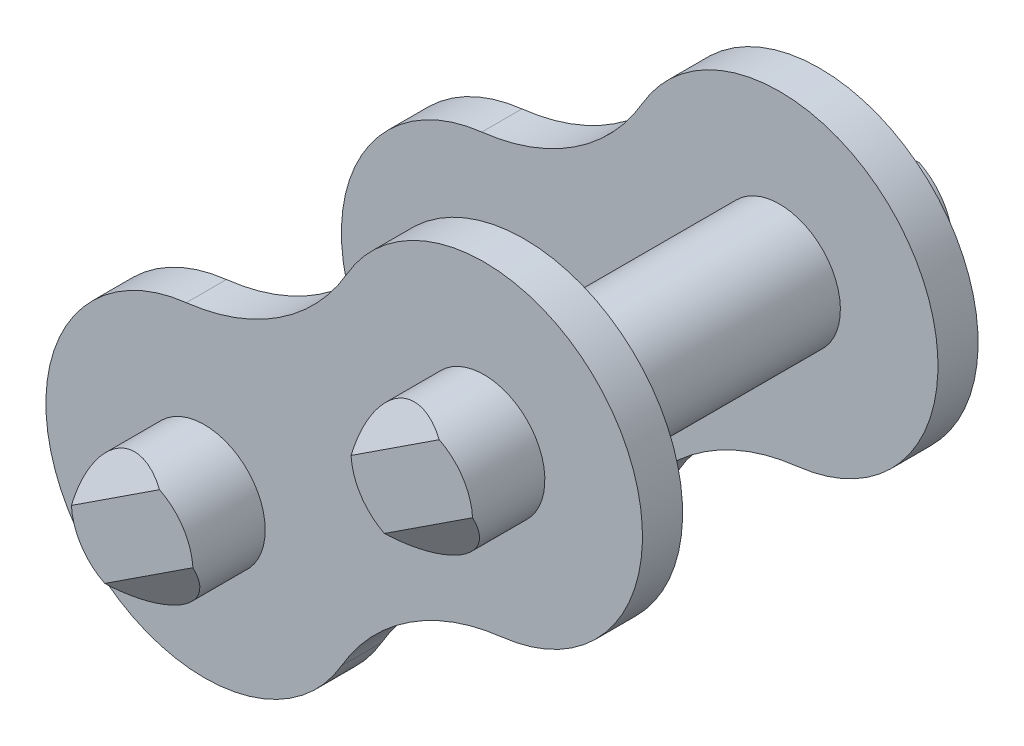
ISO-10303-21;
HEADER;
FILE_DESCRIPTION(('STEP AP214'),'2;1');
FILE_NAME('part.step','',(''),(''),'','','');
FILE_SCHEMA(('AUTOMOTIVE_DESIGN { 1 0 10303 214 1 1 1 1 }'));
ENDSEC;
DATA;
#1=APPLICATION_CONTEXT('core data for automotive mechanical design processes');
#2=APPLICATION_PROTOCOL_DEFINITION('international standard','automotive_design',2000,#1);
#3=PRODUCT_CONTEXT('',#1,'mechanical');
#4=PRODUCT('Part','Part','',(#3));
#5=PRODUCT_RELATED_PRODUCT_CATEGORY('part','',(#4));
#6=PRODUCT_DEFINITION_FORMATION('','',#4);
#7=PRODUCT_DEFINITION_CONTEXT('part definition',#1,'design');
#8=PRODUCT_DEFINITION('design','',#6,#7);
#9=PRODUCT_DEFINITION_SHAPE('','',#8);
#10=(LENGTH_UNIT() NAMED_UNIT(*) SI_UNIT(.MILLI.,.METRE.));
#11=(NAMED_UNIT(*) PLANE_ANGLE_UNIT() SI_UNIT($,.RADIAN.));
#12=(NAMED_UNIT(*) SI_UNIT($,.STERADIAN.) SOLID_ANGLE_UNIT());
#13=UNCERTAINTY_MEASURE_WITH_UNIT(LENGTH_MEASURE(1.E-05),#10,'distance_accuracy_value','');
#14=(GEOMETRIC_REPRESENTATION_CONTEXT(3) GLOBAL_UNCERTAINTY_ASSIGNED_CONTEXT((#13)) GLOBAL_UNIT_ASSIGNED_CONTEXT((#10,
#11,#12)) REPRESENTATION_CONTEXT('',''));
#15=CARTESIAN_POINT('',(0.,0.,0.));
#16=DIRECTION('',(0.,0.,1.));
#17=DIRECTION('',(1.,0.,0.));
#18=AXIS2_PLACEMENT_3D('',#15,#16,#17);
#19=CARTESIAN_POINT('',(136.884786211121,92.557643133282,-131.392489073474));
#20=DIRECTION('',(-0.273886737642538,0.418313345404528,0.866025403784439));
#21=DIRECTION('',(0.836626690809055,0.547773475285076,0.));
#22=AXIS2_PLACEMENT_3D('',#19,#20,#21);
#23=PLANE('',#22);
#24=CARTESIAN_POINT('',(124.276678374679,85.3386383935496,-131.892921853051));
#25=DIRECTION('',(0.273886737642538,-0.418313345404528,-0.866025403784439));
#26=DIRECTION('',(0.474385745116164,-0.724539967724751,0.5));
#27=AXIS2_PLACEMENT_3D('',#24,#25,#26);
#28=ELLIPSE('',#27,1.3344874122049,1.1557);
#29=CARTESIAN_POINT('',(125.430560118072,85.4034412658964,-131.5593));
#30=VERTEX_POINT('',#29);
#31=CARTESIAN_POINT('',(123.755858436673,84.3069460546349,-131.5593));
#32=VERTEX_POINT('',#31);
#33=EDGE_CURVE('E346',#30,#32,#28,.T.);
#34=ORIENTED_EDGE('',*,*,#33,.T.);
#35=DIRECTION('',(-0.836626690809055,-0.547773475285076,0.));
#36=VECTOR('',#35,1.);
#37=CARTESIAN_POINT('',(136.726520759775,92.799365499924,-131.5593));
#38=LINE('',#37,#36);
#39=EDGE_CURVE('E327',#30,#32,#38,.T.);
#40=ORIENTED_EDGE('',*,*,#39,.F.);
#41=EDGE_LOOP('',(#34,#40));
#42=FACE_BOUND('',#41,.T.);
#43=ADVANCED_FACE('F17',(#42),#23,.F.);
#44=CARTESIAN_POINT('',(135.935193503041,94.0079773331341,-131.392489073474));
#45=DIRECTION('',(-0.273886737642539,0.418313345404529,-0.866025403784438));
#46=DIRECTION('',(-0.953454531111595,0.,0.301536825450506));
#47=AXIS2_PLACEMENT_3D('',#44,#45,#46);
#48=PLANE('',#47);
#49=CARTESIAN_POINT('',(124.276678374679,85.3386383935496,-131.892921853051));
#50=DIRECTION('',(0.273886737642538,-0.418313345404528,0.866025403784439));
#51=DIRECTION('',(-0.474385745116163,0.724539967724751,0.5));
#52=AXIS2_PLACEMENT_3D('',#49,#50,#51);
#53=ELLIPSE('',#52,1.3344874122049,1.1557);
#54=CARTESIAN_POINT('',(124.797498312685,86.3703307324644,-131.5593));
#55=VERTEX_POINT('',#54);
#56=CARTESIAN_POINT('',(123.122796631286,85.2738355212029,-131.5593));
#57=VERTEX_POINT('',#56);
#58=EDGE_CURVE('E307',#55,#57,#53,.T.);
#59=ORIENTED_EDGE('',*,*,#58,.F.);
#60=DIRECTION('',(-0.836626690809055,-0.547773475285076,0.));
#61=VECTOR('',#60,1.);
#62=CARTESIAN_POINT('',(136.093458954388,93.766254966492,-131.5593));
#63=LINE('',#62,#61);
#64=EDGE_CURVE('E235',#55,#57,#63,.T.);
#65=ORIENTED_EDGE('',*,*,#64,.T.);
#66=EDGE_LOOP('',(#59,#65));
#67=FACE_BOUND('',#66,.T.);
#68=ADVANCED_FACE('F440',(#67),#48,.T.);
#69=CARTESIAN_POINT('',(136.884786211121,92.557643133282,-131.392489073474));
#70=DIRECTION('',(-0.273886737642538,0.418313345404528,0.866025403784439));
#71=DIRECTION('',(0.836626690809055,0.547773475285076,0.));
#72=AXIS2_PLACEMENT_3D('',#69,#70,#71);
#73=PLANE('',#72);
#74=CARTESIAN_POINT('',(118.964098888041,81.8602768254894,-131.892921853051));
#75=DIRECTION('',(0.273886737642538,-0.418313345404528,-0.866025403784439));
#76=DIRECTION('',(0.474385745116164,-0.724539967724751,0.5));
#77=AXIS2_PLACEMENT_3D('',#74,#75,#76);
#78=ELLIPSE('',#77,1.3344874122049,1.1557);
#79=CARTESIAN_POINT('',(120.117980631434,81.9250796978361,-131.5593));
#80=VERTEX_POINT('',#79);
#81=CARTESIAN_POINT('',(118.443278950035,80.8285844865746,-131.5593));
#82=VERTEX_POINT('',#81);
#83=EDGE_CURVE('E222',#80,#82,#78,.T.);
#84=ORIENTED_EDGE('',*,*,#83,.T.);
#85=DIRECTION('',(-0.836626690809055,-0.547773475285076,0.));
#86=VECTOR('',#85,1.);
#87=CARTESIAN_POINT('',(136.726520759775,92.799365499924,-131.5593));
#88=LINE('',#87,#86);
#89=EDGE_CURVE('E206',#80,#82,#88,.T.);
#90=ORIENTED_EDGE('',*,*,#89,.F.);
#91=EDGE_LOOP('',(#84,#90));
#92=FACE_BOUND('',#91,.T.);
#93=ADVANCED_FACE('F227',(#92),#73,.F.);
#94=CARTESIAN_POINT('',(135.935193503041,94.0079773331341,-131.392489073474));
#95=DIRECTION('',(-0.273886737642539,0.418313345404529,-0.866025403784438));
#96=DIRECTION('',(-0.953454531111595,0.,0.301536825450506));
#97=AXIS2_PLACEMENT_3D('',#94,#95,#96);
#98=PLANE('',#97);
#99=CARTESIAN_POINT('',(118.964098888041,81.8602768254894,-131.892921853051));
#100=DIRECTION('',(0.273886737642538,-0.418313345404528,0.866025403784439));
#101=DIRECTION('',(-0.474385745116163,0.724539967724751,0.5));
#102=AXIS2_PLACEMENT_3D('',#99,#100,#101);
#103=ELLIPSE('',#102,1.3344874122049,1.1557);
#104=CARTESIAN_POINT('',(119.484918826047,82.8919691644042,-131.5593));
#105=VERTEX_POINT('',#104);
#106=CARTESIAN_POINT('',(117.810217144648,81.7954739531427,-131.5593));
#107=VERTEX_POINT('',#106);
#108=EDGE_CURVE('E224',#105,#107,#103,.T.);
#109=ORIENTED_EDGE('',*,*,#108,.F.);
#110=DIRECTION('',(-0.836626690809055,-0.547773475285076,0.));
#111=VECTOR('',#110,1.);
#112=CARTESIAN_POINT('',(136.093458954388,93.766254966492,-131.5593));
#113=LINE('',#112,#111);
#114=EDGE_CURVE('E217',#105,#107,#113,.T.);
#115=ORIENTED_EDGE('',*,*,#114,.T.);
#116=EDGE_LOOP('',(#109,#115));
#117=FACE_BOUND('',#116,.T.);
#118=ADVANCED_FACE('F474',(#117),#98,.T.);
#119=CARTESIAN_POINT('',(121.62038863136,83.5994576095195,-129.4257));
#120=DIRECTION('',(0.,0.,-1.));
#121=DIRECTION('',(0.,-1.,0.));
#122=AXIS2_PLACEMENT_3D('',#119,#120,#121);
#123=PLANE('',#122);
#124=CARTESIAN_POINT('',(124.276678374679,85.3386383935496,-129.4257));
#125=DIRECTION('',(0.,0.,1.));
#126=DIRECTION('',(-0.836626690809055,-0.547773475285076,0.));
#127=AXIS2_PLACEMENT_3D('',#124,#125,#126);
#128=CIRCLE('',#127,1.1557);
#129=CARTESIAN_POINT('',(123.309788908111,84.7055765881626,-129.4257));
#130=VERTEX_POINT('',#129);
#131=EDGE_CURVE('E340',#130,#130,#128,.T.);
#132=ORIENTED_EDGE('',*,*,#131,.F.);
#133=EDGE_LOOP('',(#132));
#134=FACE_BOUND('',#133,.T.);
#135=CARTESIAN_POINT('',(118.964098888041,81.8602768254894,-129.4257));
#136=DIRECTION('',(0.,0.,1.));
#137=DIRECTION('',(-0.836626690809055,-0.547773475285076,0.));
#138=AXIS2_PLACEMENT_3D('',#135,#136,#137);
#139=CIRCLE('',#138,1.1557);
#140=CARTESIAN_POINT('',(117.997209421473,81.2272150201025,-129.4257));
#141=VERTEX_POINT('',#140);
#142=EDGE_CURVE('E337',#141,#141,#139,.T.);
#143=ORIENTED_EDGE('',*,*,#142,.F.);
#144=EDGE_LOOP('',(#143));
#145=FACE_BOUND('',#144,.T.);
#146=CARTESIAN_POINT('',(118.157323782052,88.8886740751868,-129.4257));
#147=DIRECTION('',(0.,0.,1.));
#148=DIRECTION('',(-0.836626690809055,-0.547773475285076,0.));
#149=AXIS2_PLACEMENT_3D('',#146,#147,#148);
#150=CIRCLE('',#149,4.06464973628698);
#151=CARTESIAN_POINT('',(118.620852677041,84.8505410359955,-129.4257));
#152=VERTEX_POINT('',#151);
#153=CARTESIAN_POINT('',(121.67317057914,86.8490175408405,-129.4257));
#154=VERTEX_POINT('',#153);
#155=EDGE_CURVE('E241',#152,#154,#150,.T.);
#156=ORIENTED_EDGE('',*,*,#155,.F.);
#157=CARTESIAN_POINT('',(118.964098888041,81.8602768254894,-129.4257));
#158=DIRECTION('',(0.,0.,1.));
#159=DIRECTION('',(-0.836626690809055,-0.547773475285076,0.));
#160=AXIS2_PLACEMENT_3D('',#157,#158,#159);
#161=CIRCLE('',#160,3.0099);
#162=CARTESIAN_POINT('',(121.56760668358,80.3498976781986,-129.4257));
#163=VERTEX_POINT('',#162);
#164=EDGE_CURVE('E256',#152,#163,#161,.T.);
#165=ORIENTED_EDGE('',*,*,#164,.T.);
#166=CARTESIAN_POINT('',(125.083453480668,78.3102411438523,-129.4257));
#167=DIRECTION('',(0.,0.,1.));
#168=DIRECTION('',(-0.836626690809055,-0.547773475285076,0.));
#169=AXIS2_PLACEMENT_3D('',#166,#167,#168);
#170=CIRCLE('',#169,4.06464973628691);
#171=CARTESIAN_POINT('',(124.61992458568,82.3483741830435,-129.4257));
#172=VERTEX_POINT('',#171);
#173=EDGE_CURVE('E56',#172,#163,#170,.T.);
#174=ORIENTED_EDGE('',*,*,#173,.F.);
#175=CARTESIAN_POINT('',(124.276678374679,85.3386383935496,-129.4257));
#176=DIRECTION('',(0.,0.,1.));
#177=DIRECTION('',(-0.836626690809055,-0.547773475285076,0.));
#178=AXIS2_PLACEMENT_3D('',#175,#176,#177);
#179=CIRCLE('',#178,3.0099);
#180=EDGE_CURVE('E26',#172,#154,#179,.T.);
#181=ORIENTED_EDGE('',*,*,#180,.T.);
#182=EDGE_LOOP('',(#156,#165,#174,#181));
#183=FACE_BOUND('',#182,.T.);
#184=ADVANCED_FACE('F272',(#134,#145,#183),#123,.F.);
#185=CARTESIAN_POINT('',(121.62038863136,83.5994576095195,-130.1877));
#186=DIRECTION('',(0.,0.,-1.));
#187=DIRECTION('',(0.,-1.,0.));
#188=AXIS2_PLACEMENT_3D('',#185,#186,#187);
#189=PLANE('',#188);
#190=CARTESIAN_POINT('',(124.276678374679,85.3386383935496,-130.1877));
#191=DIRECTION('',(0.,0.,1.));
#192=DIRECTION('',(-0.836626690809055,-0.547773475285076,0.));
#193=AXIS2_PLACEMENT_3D('',#190,#191,#192);
#194=CIRCLE('',#193,1.1557);
#195=CARTESIAN_POINT('',(123.309788908111,84.7055765881626,-130.1877));
#196=VERTEX_POINT('',#195);
#197=EDGE_CURVE('E343',#196,#196,#194,.T.);
#198=ORIENTED_EDGE('',*,*,#197,.T.);
#199=EDGE_LOOP('',(#198));
#200=FACE_BOUND('',#199,.T.);
#201=CARTESIAN_POINT('',(118.964098888041,81.8602768254894,-130.1877));
#202=DIRECTION('',(0.,0.,1.));
#203=DIRECTION('',(-0.836626690809055,-0.547773475285076,0.));
#204=AXIS2_PLACEMENT_3D('',#201,#202,#203);
#205=CIRCLE('',#204,1.1557);
#206=CARTESIAN_POINT('',(117.997209421473,81.2272150201025,-130.1877));
#207=VERTEX_POINT('',#206);
#208=EDGE_CURVE('E229',#207,#207,#205,.T.);
#209=ORIENTED_EDGE('',*,*,#208,.T.);
#210=EDGE_LOOP('',(#209));
#211=FACE_BOUND('',#210,.T.);
#212=CARTESIAN_POINT('',(118.157323782052,88.8886740751868,-130.1877));
#213=DIRECTION('',(0.,0.,1.));
#214=DIRECTION('',(-0.836626690809055,-0.547773475285076,0.));
#215=AXIS2_PLACEMENT_3D('',#212,#213,#214);
#216=CIRCLE('',#215,4.06464973628698);
#217=CARTESIAN_POINT('',(118.620852677041,84.8505410359955,-130.1877));
#218=VERTEX_POINT('',#217);
#219=CARTESIAN_POINT('',(121.67317057914,86.8490175408405,-130.1877));
#220=VERTEX_POINT('',#219);
#221=EDGE_CURVE('E249',#218,#220,#216,.T.);
#222=ORIENTED_EDGE('',*,*,#221,.T.);
#223=CARTESIAN_POINT('',(124.276678374679,85.3386383935496,-130.1877));
#224=DIRECTION('',(0.,0.,1.));
#225=DIRECTION('',(-0.836626690809055,-0.547773475285076,0.));
#226=AXIS2_PLACEMENT_3D('',#223,#224,#225);
#227=CIRCLE('',#226,3.0099);
#228=CARTESIAN_POINT('',(124.61992458568,82.3483741830435,-130.1877));
#229=VERTEX_POINT('',#228);
#230=EDGE_CURVE('E11',#229,#220,#227,.T.);
#231=ORIENTED_EDGE('',*,*,#230,.F.);
#232=CARTESIAN_POINT('',(125.083453480668,78.3102411438523,-130.1877));
#233=DIRECTION('',(0.,0.,1.));
#234=DIRECTION('',(-0.836626690809055,-0.547773475285076,0.));
#235=AXIS2_PLACEMENT_3D('',#232,#233,#234);
#236=CIRCLE('',#235,4.06464973628691);
#237=CARTESIAN_POINT('',(121.56760668358,80.3498976781986,-130.1877));
#238=VERTEX_POINT('',#237);
#239=EDGE_CURVE('E47',#229,#238,#236,.T.);
#240=ORIENTED_EDGE('',*,*,#239,.T.);
#241=CARTESIAN_POINT('',(118.964098888041,81.8602768254894,-130.1877));
#242=DIRECTION('',(0.,0.,1.));
#243=DIRECTION('',(-0.836626690809055,-0.547773475285076,0.));
#244=AXIS2_PLACEMENT_3D('',#241,#242,#243);
#245=CIRCLE('',#244,3.0099);
#246=EDGE_CURVE('E62',#218,#238,#245,.T.);
#247=ORIENTED_EDGE('',*,*,#246,.F.);
#248=EDGE_LOOP('',(#222,#231,#240,#247));
#249=FACE_BOUND('',#248,.T.);
#250=ADVANCED_FACE('F471',(#200,#211,#249),#189,.T.);
#251=CARTESIAN_POINT('',(124.276678374679,85.3386383935496,-130.1877));
#252=DIRECTION('',(0.,0.,1.));
#253=DIRECTION('',(0.836626690809055,0.547773475285076,0.));
#254=AXIS2_PLACEMENT_3D('',#251,#252,#253);
#255=CYLINDRICAL_SURFACE('',#254,3.0099);
#256=ORIENTED_EDGE('',*,*,#180,.F.);
#257=DIRECTION('',(0.,0.,1.));
#258=VECTOR('',#257,1.);
#259=CARTESIAN_POINT('',(124.61992458568,82.3483741830435,-130.1877));
#260=LINE('',#259,#258);
#261=EDGE_CURVE('E266',#229,#172,#260,.T.);
#262=ORIENTED_EDGE('',*,*,#261,.F.);
#263=ORIENTED_EDGE('',*,*,#230,.T.);
#264=DIRECTION('',(0.,0.,1.));
#265=VECTOR('',#264,1.);
#266=CARTESIAN_POINT('',(121.67317057914,86.8490175408405,-130.1877));
#267=LINE('',#266,#265);
#268=EDGE_CURVE('E245',#220,#154,#267,.T.);
#269=ORIENTED_EDGE('',*,*,#268,.T.);
#270=EDGE_LOOP('',(#256,#262,#263,#269));
#271=FACE_BOUND('',#270,.T.);
#272=ADVANCED_FACE('F276',(#271),#255,.T.);
#273=CARTESIAN_POINT('',(125.083453480668,78.3102411438523,-130.1877));
#274=DIRECTION('',(0.,0.,1.));
#275=DIRECTION('',(0.836626690809055,0.547773475285076,0.));
#276=AXIS2_PLACEMENT_3D('',#273,#274,#275);
#277=CYLINDRICAL_SURFACE('',#276,4.06464973628691);
#278=ORIENTED_EDGE('',*,*,#173,.T.);
#279=DIRECTION('',(0.,0.,1.));
#280=VECTOR('',#279,1.);
#281=CARTESIAN_POINT('',(121.56760668358,80.3498976781986,-130.1877));
#282=LINE('',#281,#280);
#283=EDGE_CURVE('E259',#238,#163,#282,.T.);
#284=ORIENTED_EDGE('',*,*,#283,.F.);
#285=ORIENTED_EDGE('',*,*,#239,.F.);
#286=ORIENTED_EDGE('',*,*,#261,.T.);
#287=EDGE_LOOP('',(#278,#284,#285,#286));
#288=FACE_BOUND('',#287,.T.);
#289=ADVANCED_FACE('F466',(#288),#277,.F.);
#290=CARTESIAN_POINT('',(118.964098888041,81.8602768254894,-130.1877));
#291=DIRECTION('',(0.,0.,1.));
#292=DIRECTION('',(0.836626690809055,0.547773475285076,0.));
#293=AXIS2_PLACEMENT_3D('',#290,#291,#292);
#294=CYLINDRICAL_SURFACE('',#293,3.0099);
#295=ORIENTED_EDGE('',*,*,#164,.F.);
#296=DIRECTION('',(0.,0.,1.));
#297=VECTOR('',#296,1.);
#298=CARTESIAN_POINT('',(118.620852677041,84.8505410359955,-130.1877));
#299=LINE('',#298,#297);
#300=EDGE_CURVE('E252',#218,#152,#299,.T.);
#301=ORIENTED_EDGE('',*,*,#300,.F.);
#302=ORIENTED_EDGE('',*,*,#246,.T.);
#303=ORIENTED_EDGE('',*,*,#283,.T.);
#304=EDGE_LOOP('',(#295,#301,#302,#303));
#305=FACE_BOUND('',#304,.T.);
#306=ADVANCED_FACE('F281',(#305),#294,.T.);
#307=CARTESIAN_POINT('',(118.157323782052,88.8886740751868,-130.1877));
#308=DIRECTION('',(0.,0.,1.));
#309=DIRECTION('',(0.836626690809055,0.547773475285076,0.));
#310=AXIS2_PLACEMENT_3D('',#307,#308,#309);
#311=CYLINDRICAL_SURFACE('',#310,4.06464973628698);
#312=ORIENTED_EDGE('',*,*,#155,.T.);
#313=ORIENTED_EDGE('',*,*,#268,.F.);
#314=ORIENTED_EDGE('',*,*,#221,.F.);
#315=ORIENTED_EDGE('',*,*,#300,.T.);
#316=EDGE_LOOP('',(#312,#313,#314,#315));
#317=FACE_BOUND('',#316,.T.);
#318=ADVANCED_FACE('F279',(#317),#311,.F.);
#319=CARTESIAN_POINT('',(121.62038863136,83.5994576095195,-131.5593));
#320=DIRECTION('',(0.,0.,-1.));
#321=DIRECTION('',(0.,-1.,0.));
#322=AXIS2_PLACEMENT_3D('',#319,#320,#321);
#323=PLANE('',#322);
#324=ORIENTED_EDGE('',*,*,#89,.T.);
#325=CARTESIAN_POINT('',(118.964098888041,81.8602768254894,-131.5593));
#326=DIRECTION('',(0.,0.,1.));
#327=DIRECTION('',(-0.836626690809055,-0.547773475285076,0.));
#328=AXIS2_PLACEMENT_3D('',#325,#326,#327);
#329=CIRCLE('',#328,1.1557);
#330=EDGE_CURVE('E209',#107,#82,#329,.T.);
#331=ORIENTED_EDGE('',*,*,#330,.F.);
#332=ORIENTED_EDGE('',*,*,#114,.F.);
#333=CARTESIAN_POINT('',(118.964098888041,81.8602768254894,-131.5593));
#334=DIRECTION('',(0.,0.,1.));
#335=DIRECTION('',(-0.836626690809055,-0.547773475285076,0.));
#336=AXIS2_PLACEMENT_3D('',#333,#334,#335);
#337=CIRCLE('',#336,1.1557);
#338=EDGE_CURVE('E212',#80,#105,#337,.T.);
#339=ORIENTED_EDGE('',*,*,#338,.F.);
#340=EDGE_LOOP('',(#324,#331,#332,#339));
#341=FACE_BOUND('',#340,.T.);
#342=ADVANCED_FACE('F208',(#341),#323,.T.);
#343=CARTESIAN_POINT('',(118.964098888041,81.8602768254894,-131.5593));
#344=DIRECTION('',(0.,0.,1.));
#345=DIRECTION('',(0.836626690809055,0.547773475285076,0.));
#346=AXIS2_PLACEMENT_3D('',#343,#344,#345);
#347=CYLINDRICAL_SURFACE('',#346,1.1557);
#348=ORIENTED_EDGE('',*,*,#83,.F.);
#349=ORIENTED_EDGE('',*,*,#338,.T.);
#350=ORIENTED_EDGE('',*,*,#108,.T.);
#351=ORIENTED_EDGE('',*,*,#330,.T.);
#352=EDGE_LOOP('',(#348,#349,#350,#351));
#353=FACE_BOUND('',#352,.T.);
#354=ORIENTED_EDGE('',*,*,#208,.F.);
#355=EDGE_LOOP('',(#354));
#356=FACE_BOUND('',#355,.T.);
#357=ADVANCED_FACE('F220',(#353,#356),#347,.T.);
#358=CARTESIAN_POINT('',(121.62038863136,83.5994576095195,-131.5593));
#359=DIRECTION('',(0.,0.,-1.));
#360=DIRECTION('',(0.,-1.,0.));
#361=AXIS2_PLACEMENT_3D('',#358,#359,#360);
#362=PLANE('',#361);
#363=ORIENTED_EDGE('',*,*,#39,.T.);
#364=CARTESIAN_POINT('',(124.276678374679,85.3386383935496,-131.5593));
#365=DIRECTION('',(0.,0.,1.));
#366=DIRECTION('',(-0.836626690809055,-0.547773475285076,0.));
#367=AXIS2_PLACEMENT_3D('',#364,#365,#366);
#368=CIRCLE('',#367,1.1557);
#369=EDGE_CURVE('E311',#57,#32,#368,.T.);
#370=ORIENTED_EDGE('',*,*,#369,.F.);
#371=ORIENTED_EDGE('',*,*,#64,.F.);
#372=CARTESIAN_POINT('',(124.276678374679,85.3386383935496,-131.5593));
#373=DIRECTION('',(0.,0.,1.));
#374=DIRECTION('',(-0.836626690809055,-0.547773475285076,0.));
#375=AXIS2_PLACEMENT_3D('',#372,#373,#374);
#376=CIRCLE('',#375,1.1557);
#377=EDGE_CURVE('E312',#30,#55,#376,.T.);
#378=ORIENTED_EDGE('',*,*,#377,.F.);
#379=EDGE_LOOP('',(#363,#370,#371,#378));
#380=FACE_BOUND('',#379,.T.);
#381=ADVANCED_FACE('F450',(#380),#362,.T.);
#382=CARTESIAN_POINT('',(124.276678374679,85.3386383935496,-131.5593));
#383=DIRECTION('',(0.,0.,1.));
#384=DIRECTION('',(0.836626690809055,0.547773475285076,0.));
#385=AXIS2_PLACEMENT_3D('',#382,#383,#384);
#386=CYLINDRICAL_SURFACE('',#385,1.1557);
#387=ORIENTED_EDGE('',*,*,#33,.F.);
#388=ORIENTED_EDGE('',*,*,#377,.T.);
#389=ORIENTED_EDGE('',*,*,#58,.T.);
#390=ORIENTED_EDGE('',*,*,#369,.T.);
#391=EDGE_LOOP('',(#387,#388,#389,#390));
#392=FACE_BOUND('',#391,.T.);
#393=ORIENTED_EDGE('',*,*,#197,.F.);
#394=EDGE_LOOP('',(#393));
#395=FACE_BOUND('',#394,.T.);
#396=ADVANCED_FACE('F447',(#392,#395),#386,.T.);
#397=CARTESIAN_POINT('',(136.884786211121,92.557643133282,-122.607510926526));
#398=DIRECTION('',(-0.273886737642538,0.418313345404528,-0.866025403784439));
#399=DIRECTION('',(-0.953454531111596,0.,0.301536825450504));
#400=AXIS2_PLACEMENT_3D('',#397,#398,#399);
#401=PLANE('',#400);
#402=CARTESIAN_POINT('',(124.276678374679,85.3386383935496,-122.107078146949));
#403=DIRECTION('',(-0.273886737642538,0.418313345404528,-0.866025403784439));
#404=DIRECTION('',(0.474385745116164,-0.724539967724751,-0.5));
#405=AXIS2_PLACEMENT_3D('',#402,#403,#404);
#406=ELLIPSE('',#405,1.3344874122049,1.1557);
#407=CARTESIAN_POINT('',(125.430560118072,85.4034412658964,-122.4407));
#408=VERTEX_POINT('',#407);
#409=CARTESIAN_POINT('',(123.755858436673,84.3069460546349,-122.4407));
#410=VERTEX_POINT('',#409);
#411=EDGE_CURVE('E547',#408,#410,#406,.T.);
#412=ORIENTED_EDGE('',*,*,#411,.F.);
#413=DIRECTION('',(-0.836626690809055,-0.547773475285076,0.));
#414=VECTOR('',#413,1.);
#415=CARTESIAN_POINT('',(136.726520759775,92.799365499924,-122.4407));
#416=LINE('',#415,#414);
#417=EDGE_CURVE('E369',#408,#410,#416,.T.);
#418=ORIENTED_EDGE('',*,*,#417,.T.);
#419=EDGE_LOOP('',(#412,#418));
#420=FACE_BOUND('',#419,.T.);
#421=ADVANCED_FACE('F457',(#420),#401,.F.);
#422=CARTESIAN_POINT('',(135.935193503041,94.0079773331341,-122.607510926526));
#423=DIRECTION('',(-0.273886737642539,0.418313345404529,0.866025403784438));
#424=DIRECTION('',(0.836626690809055,0.547773475285076,0.));
#425=AXIS2_PLACEMENT_3D('',#422,#423,#424);
#426=PLANE('',#425);
#427=CARTESIAN_POINT('',(124.276678374679,85.3386383935496,-122.107078146949));
#428=DIRECTION('',(-0.273886737642538,0.418313345404528,0.866025403784439));
#429=DIRECTION('',(-0.474385745116163,0.724539967724751,-0.5));
#430=AXIS2_PLACEMENT_3D('',#427,#428,#429);
#431=ELLIPSE('',#430,1.3344874122049,1.1557);
#432=CARTESIAN_POINT('',(124.797498312685,86.3703307324644,-122.4407));
#433=VERTEX_POINT('',#432);
#434=CARTESIAN_POINT('',(123.122796631286,85.2738355212029,-122.4407));
#435=VERTEX_POINT('',#434);
#436=EDGE_CURVE('E370',#433,#435,#431,.T.);
#437=ORIENTED_EDGE('',*,*,#436,.T.);
#438=DIRECTION('',(-0.836626690809055,-0.547773475285076,0.));
#439=VECTOR('',#438,1.);
#440=CARTESIAN_POINT('',(136.093458954388,93.766254966492,-122.4407));
#441=LINE('',#440,#439);
#442=EDGE_CURVE('E375',#433,#435,#441,.T.);
#443=ORIENTED_EDGE('',*,*,#442,.F.);
#444=EDGE_LOOP('',(#437,#443));
#445=FACE_BOUND('',#444,.T.);
#446=ADVANCED_FACE('F515',(#445),#426,.T.);
#447=CARTESIAN_POINT('',(136.884786211121,92.557643133282,-122.607510926526));
#448=DIRECTION('',(-0.273886737642538,0.418313345404528,-0.866025403784439));
#449=DIRECTION('',(-0.953454531111596,0.,0.301536825450504));
#450=AXIS2_PLACEMENT_3D('',#447,#448,#449);
#451=PLANE('',#450);
#452=CARTESIAN_POINT('',(118.964098888041,81.8602768254894,-122.107078146949));
#453=DIRECTION('',(-0.273886737642538,0.418313345404528,-0.866025403784439));
#454=DIRECTION('',(0.474385745116164,-0.724539967724751,-0.5));
#455=AXIS2_PLACEMENT_3D('',#452,#453,#454);
#456=ELLIPSE('',#455,1.3344874122049,1.1557);
#457=CARTESIAN_POINT('',(120.117980631434,81.9250796978361,-122.4407));
#458=VERTEX_POINT('',#457);
#459=CARTESIAN_POINT('',(118.443278950035,80.8285844865746,-122.4407));
#460=VERTEX_POINT('',#459);
#461=EDGE_CURVE('E384',#458,#460,#456,.T.);
#462=ORIENTED_EDGE('',*,*,#461,.F.);
#463=DIRECTION('',(-0.836626690809055,-0.547773475285076,0.));
#464=VECTOR('',#463,1.);
#465=CARTESIAN_POINT('',(136.726520759775,92.799365499924,-122.4407));
#466=LINE('',#465,#464);
#467=EDGE_CURVE('E388',#458,#460,#466,.T.);
#468=ORIENTED_EDGE('',*,*,#467,.T.);
#469=EDGE_LOOP('',(#462,#468));
#470=FACE_BOUND('',#469,.T.);
#471=ADVANCED_FACE('F512',(#470),#451,.F.);
#472=CARTESIAN_POINT('',(135.935193503041,94.0079773331341,-122.607510926526));
#473=DIRECTION('',(-0.273886737642539,0.418313345404529,0.866025403784438));
#474=DIRECTION('',(0.836626690809055,0.547773475285076,0.));
#475=AXIS2_PLACEMENT_3D('',#472,#473,#474);
#476=PLANE('',#475);
#477=CARTESIAN_POINT('',(118.964098888041,81.8602768254894,-122.107078146949));
#478=DIRECTION('',(-0.273886737642538,0.418313345404528,0.866025403784439));
#479=DIRECTION('',(-0.474385745116163,0.724539967724751,-0.5));
#480=AXIS2_PLACEMENT_3D('',#477,#478,#479);
#481=ELLIPSE('',#480,1.3344874122049,1.1557);
#482=CARTESIAN_POINT('',(119.484918826047,82.8919691644042,-122.4407));
#483=VERTEX_POINT('',#482);
#484=CARTESIAN_POINT('',(117.810217144648,81.7954739531427,-122.4407));
#485=VERTEX_POINT('',#484);
#486=EDGE_CURVE('E383',#483,#485,#481,.T.);
#487=ORIENTED_EDGE('',*,*,#486,.T.);
#488=DIRECTION('',(-0.836626690809055,-0.547773475285076,0.));
#489=VECTOR('',#488,1.);
#490=CARTESIAN_POINT('',(136.093458954388,93.766254966492,-122.4407));
#491=LINE('',#490,#489);
#492=EDGE_CURVE('E391',#483,#485,#491,.T.);
#493=ORIENTED_EDGE('',*,*,#492,.F.);
#494=EDGE_LOOP('',(#487,#493));
#495=FACE_BOUND('',#494,.T.);
#496=ADVANCED_FACE('F514',(#495),#476,.T.);
#497=CARTESIAN_POINT('',(124.276678374679,85.3386383935496,-122.4407));
#498=DIRECTION('',(0.,0.,-1.));
#499=DIRECTION('',(0.836626690809055,0.547773475285076,0.));
#500=AXIS2_PLACEMENT_3D('',#497,#498,#499);
#501=CYLINDRICAL_SURFACE('',#500,1.1557);
#502=ORIENTED_EDGE('',*,*,#131,.T.);
#503=EDGE_LOOP('',(#502));
#504=FACE_BOUND('',#503,.T.);
#505=CARTESIAN_POINT('',(124.276678374679,85.3386383935496,-124.5743));
#506=DIRECTION('',(0.,0.,1.));
#507=DIRECTION('',(-0.836626690809055,-0.547773475285076,0.));
#508=AXIS2_PLACEMENT_3D('',#505,#506,#507);
#509=CIRCLE('',#508,1.1557);
#510=CARTESIAN_POINT('',(123.309788908111,84.7055765881626,-124.5743));
#511=VERTEX_POINT('',#510);
#512=EDGE_CURVE('E334',#511,#511,#509,.T.);
#513=ORIENTED_EDGE('',*,*,#512,.F.);
#514=EDGE_LOOP('',(#513));
#515=FACE_BOUND('',#514,.T.);
#516=ADVANCED_FACE('F521',(#504,#515),#501,.T.);
#517=CARTESIAN_POINT('',(118.964098888041,81.8602768254894,-122.4407));
#518=DIRECTION('',(0.,0.,-1.));
#519=DIRECTION('',(0.836626690809055,0.547773475285076,0.));
#520=AXIS2_PLACEMENT_3D('',#517,#518,#519);
#521=CYLINDRICAL_SURFACE('',#520,1.1557);
#522=ORIENTED_EDGE('',*,*,#142,.T.);
#523=EDGE_LOOP('',(#522));
#524=FACE_BOUND('',#523,.T.);
#525=CARTESIAN_POINT('',(118.964098888041,81.8602768254894,-124.5743));
#526=DIRECTION('',(0.,0.,1.));
#527=DIRECTION('',(-0.836626690809055,-0.547773475285076,0.));
#528=AXIS2_PLACEMENT_3D('',#525,#526,#527);
#529=CIRCLE('',#528,1.1557);
#530=CARTESIAN_POINT('',(117.997209421473,81.2272150201025,-124.5743));
#531=VERTEX_POINT('',#530);
#532=EDGE_CURVE('E331',#531,#531,#529,.T.);
#533=ORIENTED_EDGE('',*,*,#532,.F.);
#534=EDGE_LOOP('',(#533));
#535=FACE_BOUND('',#534,.T.);
#536=ADVANCED_FACE('F433',(#524,#535),#521,.T.);
#537=CARTESIAN_POINT('',(121.62038863136,83.5994576095195,-124.5743));
#538=DIRECTION('',(0.,0.,1.));
#539=DIRECTION('',(1.,0.,0.));
#540=AXIS2_PLACEMENT_3D('',#537,#538,#539);
#541=PLANE('',#540);
#542=ORIENTED_EDGE('',*,*,#512,.T.);
#543=EDGE_LOOP('',(#542));
#544=FACE_BOUND('',#543,.T.);
#545=ORIENTED_EDGE('',*,*,#532,.T.);
#546=EDGE_LOOP('',(#545));
#547=FACE_BOUND('',#546,.T.);
#548=CARTESIAN_POINT('',(118.157323782052,88.8886740751868,-124.5743));
#549=DIRECTION('',(0.,0.,1.));
#550=DIRECTION('',(-0.836626690809055,-0.547773475285076,0.));
#551=AXIS2_PLACEMENT_3D('',#548,#549,#550);
#552=CIRCLE('',#551,4.06464973628698);
#553=CARTESIAN_POINT('',(118.620852677041,84.8505410359955,-124.5743));
#554=VERTEX_POINT('',#553);
#555=CARTESIAN_POINT('',(121.67317057914,86.8490175408405,-124.5743));
#556=VERTEX_POINT('',#555);
#557=EDGE_CURVE('E396',#554,#556,#552,.T.);
#558=ORIENTED_EDGE('',*,*,#557,.T.);
#559=CARTESIAN_POINT('',(124.276678374679,85.3386383935496,-124.5743));
#560=DIRECTION('',(0.,0.,1.));
#561=DIRECTION('',(-0.836626690809055,-0.547773475285076,0.));
#562=AXIS2_PLACEMENT_3D('',#559,#560,#561);
#563=CIRCLE('',#562,3.0099);
#564=CARTESIAN_POINT('',(124.61992458568,82.3483741830435,-124.5743));
#565=VERTEX_POINT('',#564);
#566=EDGE_CURVE('E324',#565,#556,#563,.T.);
#567=ORIENTED_EDGE('',*,*,#566,.F.);
#568=CARTESIAN_POINT('',(125.083453480668,78.3102411438523,-124.5743));
#569=DIRECTION('',(0.,0.,1.));
#570=DIRECTION('',(-0.836626690809055,-0.547773475285076,0.));
#571=AXIS2_PLACEMENT_3D('',#568,#569,#570);
#572=CIRCLE('',#571,4.06464973628691);
#573=CARTESIAN_POINT('',(121.56760668358,80.3498976781986,-124.5743));
#574=VERTEX_POINT('',#573);
#575=EDGE_CURVE('E316',#565,#574,#572,.T.);
#576=ORIENTED_EDGE('',*,*,#575,.T.);
#577=CARTESIAN_POINT('',(118.964098888041,81.8602768254894,-124.5743));
#578=DIRECTION('',(0.,0.,1.));
#579=DIRECTION('',(-0.836626690809055,-0.547773475285076,0.));
#580=AXIS2_PLACEMENT_3D('',#577,#578,#579);
#581=CIRCLE('',#580,3.0099);
#582=EDGE_CURVE('E298',#554,#574,#581,.T.);
#583=ORIENTED_EDGE('',*,*,#582,.F.);
#584=EDGE_LOOP('',(#558,#567,#576,#583));
#585=FACE_BOUND('',#584,.T.);
#586=ADVANCED_FACE('F417',(#544,#547,#585),#541,.F.);
#587=CARTESIAN_POINT('',(121.62038863136,83.5994576095195,-123.8123));
#588=DIRECTION('',(0.,0.,1.));
#589=DIRECTION('',(1.,0.,0.));
#590=AXIS2_PLACEMENT_3D('',#587,#588,#589);
#591=PLANE('',#590);
#592=CARTESIAN_POINT('',(124.276678374679,85.3386383935496,-123.8123));
#593=DIRECTION('',(0.,0.,1.));
#594=DIRECTION('',(-0.836626690809055,-0.547773475285076,0.));
#595=AXIS2_PLACEMENT_3D('',#592,#593,#594);
#596=CIRCLE('',#595,1.1557);
#597=CARTESIAN_POINT('',(123.309788908111,84.7055765881626,-123.8123));
#598=VERTEX_POINT('',#597);
#599=EDGE_CURVE('E552',#598,#598,#596,.T.);
#600=ORIENTED_EDGE('',*,*,#599,.F.);
#601=EDGE_LOOP('',(#600));
#602=FACE_BOUND('',#601,.T.);
#603=CARTESIAN_POINT('',(118.964098888041,81.8602768254894,-123.8123));
#604=DIRECTION('',(0.,0.,1.));
#605=DIRECTION('',(-0.836626690809055,-0.547773475285076,0.));
#606=AXIS2_PLACEMENT_3D('',#603,#604,#605);
#607=CIRCLE('',#606,1.1557);
#608=CARTESIAN_POINT('',(117.997209421473,81.2272150201025,-123.8123));
#609=VERTEX_POINT('',#608);
#610=EDGE_CURVE('E378',#609,#609,#607,.T.);
#611=ORIENTED_EDGE('',*,*,#610,.F.);
#612=EDGE_LOOP('',(#611));
#613=FACE_BOUND('',#612,.T.);
#614=CARTESIAN_POINT('',(118.157323782052,88.8886740751868,-123.8123));
#615=DIRECTION('',(0.,0.,1.));
#616=DIRECTION('',(-0.836626690809055,-0.547773475285076,0.));
#617=AXIS2_PLACEMENT_3D('',#614,#615,#616);
#618=CIRCLE('',#617,4.06464973628698);
#619=CARTESIAN_POINT('',(118.620852677041,84.8505410359955,-123.8123));
#620=VERTEX_POINT('',#619);
#621=CARTESIAN_POINT('',(121.67317057914,86.8490175408405,-123.8123));
#622=VERTEX_POINT('',#621);
#623=EDGE_CURVE('E291',#620,#622,#618,.T.);
#624=ORIENTED_EDGE('',*,*,#623,.F.);
#625=CARTESIAN_POINT('',(118.964098888041,81.8602768254894,-123.8123));
#626=DIRECTION('',(0.,0.,1.));
#627=DIRECTION('',(-0.836626690809055,-0.547773475285076,0.));
#628=AXIS2_PLACEMENT_3D('',#625,#626,#627);
#629=CIRCLE('',#628,3.0099);
#630=CARTESIAN_POINT('',(121.56760668358,80.3498976781986,-123.8123));
#631=VERTEX_POINT('',#630);
#632=EDGE_CURVE('E306',#620,#631,#629,.T.);
#633=ORIENTED_EDGE('',*,*,#632,.T.);
#634=CARTESIAN_POINT('',(125.083453480668,78.3102411438523,-123.8123));
#635=DIRECTION('',(0.,0.,1.));
#636=DIRECTION('',(-0.836626690809055,-0.547773475285076,0.));
#637=AXIS2_PLACEMENT_3D('',#634,#635,#636);
#638=CIRCLE('',#637,4.06464973628691);
#639=CARTESIAN_POINT('',(124.61992458568,82.3483741830435,-123.8123));
#640=VERTEX_POINT('',#639);
#641=EDGE_CURVE('E321',#640,#631,#638,.T.);
#642=ORIENTED_EDGE('',*,*,#641,.F.);
#643=CARTESIAN_POINT('',(124.276678374679,85.3386383935496,-123.8123));
#644=DIRECTION('',(0.,0.,1.));
#645=DIRECTION('',(-0.836626690809055,-0.547773475285076,0.));
#646=AXIS2_PLACEMENT_3D('',#643,#644,#645);
#647=CIRCLE('',#646,3.0099);
#648=EDGE_CURVE('E328',#640,#622,#647,.T.);
#649=ORIENTED_EDGE('',*,*,#648,.T.);
#650=EDGE_LOOP('',(#624,#633,#642,#649));
#651=FACE_BOUND('',#650,.T.);
#652=ADVANCED_FACE('F423',(#602,#613,#651),#591,.T.);
#653=CARTESIAN_POINT('',(124.276678374679,85.3386383935496,-123.8123));
#654=DIRECTION('',(0.,0.,-1.));
#655=DIRECTION('',(0.836626690809055,0.547773475285076,0.));
#656=AXIS2_PLACEMENT_3D('',#653,#654,#655);
#657=CYLINDRICAL_SURFACE('',#656,3.0099);
#658=ORIENTED_EDGE('',*,*,#566,.T.);
#659=DIRECTION('',(0.,0.,-1.));
#660=VECTOR('',#659,1.);
#661=CARTESIAN_POINT('',(121.67317057914,86.8490175408405,-123.8123));
#662=LINE('',#661,#660);
#663=EDGE_CURVE('E294',#622,#556,#662,.T.);
#664=ORIENTED_EDGE('',*,*,#663,.F.);
#665=ORIENTED_EDGE('',*,*,#648,.F.);
#666=DIRECTION('',(0.,0.,-1.));
#667=VECTOR('',#666,1.);
#668=CARTESIAN_POINT('',(124.61992458568,82.3483741830435,-123.8123));
#669=LINE('',#668,#667);
#670=EDGE_CURVE('E317',#640,#565,#669,.T.);
#671=ORIENTED_EDGE('',*,*,#670,.T.);
#672=EDGE_LOOP('',(#658,#664,#665,#671));
#673=FACE_BOUND('',#672,.T.);
#674=ADVANCED_FACE('F413',(#673),#657,.T.);
#675=CARTESIAN_POINT('',(125.083453480668,78.3102411438523,-123.8123));
#676=DIRECTION('',(0.,0.,-1.));
#677=DIRECTION('',(0.836626690809055,0.547773475285076,0.));
#678=AXIS2_PLACEMENT_3D('',#675,#676,#677);
#679=CYLINDRICAL_SURFACE('',#678,4.06464973628691);
#680=ORIENTED_EDGE('',*,*,#575,.F.);
#681=ORIENTED_EDGE('',*,*,#670,.F.);
#682=ORIENTED_EDGE('',*,*,#641,.T.);
#683=DIRECTION('',(0.,0.,-1.));
#684=VECTOR('',#683,1.);
#685=CARTESIAN_POINT('',(121.56760668358,80.3498976781986,-123.8123));
#686=LINE('',#685,#684);
#687=EDGE_CURVE('E302',#631,#574,#686,.T.);
#688=ORIENTED_EDGE('',*,*,#687,.T.);
#689=EDGE_LOOP('',(#680,#681,#682,#688));
#690=FACE_BOUND('',#689,.T.);
#691=ADVANCED_FACE('F421',(#690),#679,.F.);
#692=CARTESIAN_POINT('',(118.964098888041,81.8602768254894,-123.8123));
#693=DIRECTION('',(0.,0.,-1.));
#694=DIRECTION('',(0.836626690809055,0.547773475285076,0.));
#695=AXIS2_PLACEMENT_3D('',#692,#693,#694);
#696=CYLINDRICAL_SURFACE('',#695,3.0099);
#697=ORIENTED_EDGE('',*,*,#582,.T.);
#698=ORIENTED_EDGE('',*,*,#687,.F.);
#699=ORIENTED_EDGE('',*,*,#632,.F.);
#700=DIRECTION('',(0.,0.,-1.));
#701=VECTOR('',#700,1.);
#702=CARTESIAN_POINT('',(118.620852677041,84.8505410359955,-123.8123));
#703=LINE('',#702,#701);
#704=EDGE_CURVE('E289',#620,#554,#703,.T.);
#705=ORIENTED_EDGE('',*,*,#704,.T.);
#706=EDGE_LOOP('',(#697,#698,#699,#705));
#707=FACE_BOUND('',#706,.T.);
#708=ADVANCED_FACE('F406',(#707),#696,.T.);
#709=CARTESIAN_POINT('',(118.157323782052,88.8886740751868,-123.8123));
#710=DIRECTION('',(0.,0.,-1.));
#711=DIRECTION('',(0.836626690809055,0.547773475285076,0.));
#712=AXIS2_PLACEMENT_3D('',#709,#710,#711);
#713=CYLINDRICAL_SURFACE('',#712,4.06464973628698);
#714=ORIENTED_EDGE('',*,*,#557,.F.);
#715=ORIENTED_EDGE('',*,*,#704,.F.);
#716=ORIENTED_EDGE('',*,*,#623,.T.);
#717=ORIENTED_EDGE('',*,*,#663,.T.);
#718=EDGE_LOOP('',(#714,#715,#716,#717));
#719=FACE_BOUND('',#718,.T.);
#720=ADVANCED_FACE('F410',(#719),#713,.F.);
#721=CARTESIAN_POINT('',(121.62038863136,83.5994576095195,-122.4407));
#722=DIRECTION('',(0.,0.,1.));
#723=DIRECTION('',(1.,0.,0.));
#724=AXIS2_PLACEMENT_3D('',#721,#722,#723);
#725=PLANE('',#724);
#726=ORIENTED_EDGE('',*,*,#467,.F.);
#727=CARTESIAN_POINT('',(118.964098888041,81.8602768254894,-122.4407));
#728=DIRECTION('',(0.,0.,1.));
#729=DIRECTION('',(-0.836626690809055,-0.547773475285076,0.));
#730=AXIS2_PLACEMENT_3D('',#727,#728,#729);
#731=CIRCLE('',#730,1.1557);
#732=EDGE_CURVE('E392',#458,#483,#731,.T.);
#733=ORIENTED_EDGE('',*,*,#732,.T.);
#734=ORIENTED_EDGE('',*,*,#492,.T.);
#735=CARTESIAN_POINT('',(118.964098888041,81.8602768254894,-122.4407));
#736=DIRECTION('',(0.,0.,1.));
#737=DIRECTION('',(-0.836626690809055,-0.547773475285076,0.));
#738=AXIS2_PLACEMENT_3D('',#735,#736,#737);
#739=CIRCLE('',#738,1.1557);
#740=EDGE_CURVE('E379',#485,#460,#739,.T.);
#741=ORIENTED_EDGE('',*,*,#740,.T.);
#742=EDGE_LOOP('',(#726,#733,#734,#741));
#743=FACE_BOUND('',#742,.T.);
#744=ADVANCED_FACE('F499',(#743),#725,.T.);
#745=CARTESIAN_POINT('',(118.964098888041,81.8602768254894,-122.4407));
#746=DIRECTION('',(0.,0.,-1.));
#747=DIRECTION('',(0.836626690809055,0.547773475285076,0.));
#748=AXIS2_PLACEMENT_3D('',#745,#746,#747);
#749=CYLINDRICAL_SURFACE('',#748,1.1557);
#750=ORIENTED_EDGE('',*,*,#461,.T.);
#751=ORIENTED_EDGE('',*,*,#740,.F.);
#752=ORIENTED_EDGE('',*,*,#486,.F.);
#753=ORIENTED_EDGE('',*,*,#732,.F.);
#754=EDGE_LOOP('',(#750,#751,#752,#753));
#755=FACE_BOUND('',#754,.T.);
#756=ORIENTED_EDGE('',*,*,#610,.T.);
#757=EDGE_LOOP('',(#756));
#758=FACE_BOUND('',#757,.T.);
#759=ADVANCED_FACE('F492',(#755,#758),#749,.T.);
#760=CARTESIAN_POINT('',(121.62038863136,83.5994576095195,-122.4407));
#761=DIRECTION('',(0.,0.,1.));
#762=DIRECTION('',(1.,0.,0.));
#763=AXIS2_PLACEMENT_3D('',#760,#761,#762);
#764=PLANE('',#763);
#765=ORIENTED_EDGE('',*,*,#417,.F.);
#766=CARTESIAN_POINT('',(124.276678374679,85.3386383935496,-122.4407));
#767=DIRECTION('',(0.,0.,1.));
#768=DIRECTION('',(-0.836626690809055,-0.547773475285076,0.));
#769=AXIS2_PLACEMENT_3D('',#766,#767,#768);
#770=CIRCLE('',#769,1.1557);
#771=EDGE_CURVE('E366',#408,#433,#770,.T.);
#772=ORIENTED_EDGE('',*,*,#771,.T.);
#773=ORIENTED_EDGE('',*,*,#442,.T.);
#774=CARTESIAN_POINT('',(124.276678374679,85.3386383935496,-122.4407));
#775=DIRECTION('',(0.,0.,1.));
#776=DIRECTION('',(-0.836626690809055,-0.547773475285076,0.));
#777=AXIS2_PLACEMENT_3D('',#774,#775,#776);
#778=CIRCLE('',#777,1.1557);
#779=EDGE_CURVE('E540',#435,#410,#778,.T.);
#780=ORIENTED_EDGE('',*,*,#779,.T.);
#781=EDGE_LOOP('',(#765,#772,#773,#780));
#782=FACE_BOUND('',#781,.T.);
#783=ADVANCED_FACE('F488',(#782),#764,.T.);
#784=CARTESIAN_POINT('',(124.276678374679,85.3386383935496,-122.4407));
#785=DIRECTION('',(0.,0.,-1.));
#786=DIRECTION('',(0.836626690809055,0.547773475285076,0.));
#787=AXIS2_PLACEMENT_3D('',#784,#785,#786);
#788=CYLINDRICAL_SURFACE('',#787,1.1557);
#789=ORIENTED_EDGE('',*,*,#411,.T.);
#790=ORIENTED_EDGE('',*,*,#779,.F.);
#791=ORIENTED_EDGE('',*,*,#436,.F.);
#792=ORIENTED_EDGE('',*,*,#771,.F.);
#793=EDGE_LOOP('',(#789,#790,#791,#792));
#794=FACE_BOUND('',#793,.T.);
#795=ORIENTED_EDGE('',*,*,#599,.T.);
#796=EDGE_LOOP('',(#795));
#797=FACE_BOUND('',#796,.T.);
#798=ADVANCED_FACE('F491',(#794,#797),#788,.T.);
#799=CLOSED_SHELL('',(#43,#68,#93,#118,#184,#250,#272,#289,#306,#318,#342,#357,#381,#396,#421,
#446,#471,#496,#516,#536,#586,#652,#674,#691,#708,#720,#744,#759,#783,#798));
#800=MANIFOLD_SOLID_BREP('B1',#799);
#801=ADVANCED_BREP_SHAPE_REPRESENTATION('',(#18,#800),#14);
#802=SHAPE_DEFINITION_REPRESENTATION(#9,#801);
ENDSEC;
END-ISO-10303-21;
